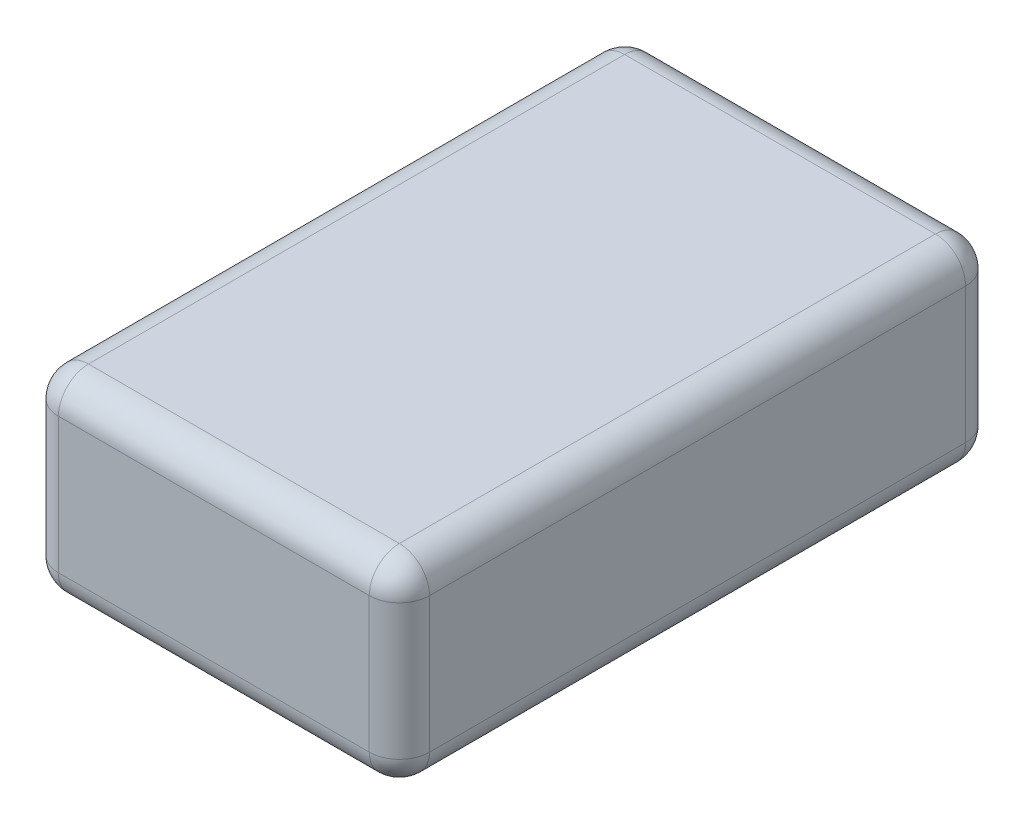
ISO-10303-21;
HEADER;
FILE_DESCRIPTION(('STEP AP214'),'2;1');
FILE_NAME('part.step','',(''),(''),'','','');
FILE_SCHEMA(('AUTOMOTIVE_DESIGN { 1 0 10303 214 1 1 1 1 }'));
ENDSEC;
DATA;
#1=APPLICATION_CONTEXT('core data for automotive mechanical design processes');
#2=APPLICATION_PROTOCOL_DEFINITION('international standard','automotive_design',2000,#1);
#3=PRODUCT_CONTEXT('',#1,'mechanical');
#4=PRODUCT('Part','Part','',(#3));
#5=PRODUCT_RELATED_PRODUCT_CATEGORY('part','',(#4));
#6=PRODUCT_DEFINITION_FORMATION('','',#4);
#7=PRODUCT_DEFINITION_CONTEXT('part definition',#1,'design');
#8=PRODUCT_DEFINITION('design','',#6,#7);
#9=PRODUCT_DEFINITION_SHAPE('','',#8);
#10=(LENGTH_UNIT() NAMED_UNIT(*) SI_UNIT(.MILLI.,.METRE.));
#11=(NAMED_UNIT(*) PLANE_ANGLE_UNIT() SI_UNIT($,.RADIAN.));
#12=(NAMED_UNIT(*) SI_UNIT($,.STERADIAN.) SOLID_ANGLE_UNIT());
#13=UNCERTAINTY_MEASURE_WITH_UNIT(LENGTH_MEASURE(1.E-05),#10,'distance_accuracy_value','');
#14=(GEOMETRIC_REPRESENTATION_CONTEXT(3) GLOBAL_UNCERTAINTY_ASSIGNED_CONTEXT((#13)) GLOBAL_UNIT_ASSIGNED_CONTEXT((#10,
#11,#12)) REPRESENTATION_CONTEXT('',''));
#15=CARTESIAN_POINT('',(0.,0.,0.));
#16=DIRECTION('',(0.,0.,1.));
#17=DIRECTION('',(1.,0.,0.));
#18=AXIS2_PLACEMENT_3D('',#15,#16,#17);
#19=CARTESIAN_POINT('',(113.2,10.,198.));
#20=DIRECTION('',(0.,0.,-1.));
#21=DIRECTION('',(-1.,0.,0.));
#22=AXIS2_PLACEMENT_3D('',#19,#20,#21);
#23=CYLINDRICAL_SURFACE('',#22,10.);
#24=DIRECTION('',(0.,0.,-1.));
#25=VECTOR('',#24,1.);
#26=CARTESIAN_POINT('',(113.2,0.,198.));
#27=LINE('',#26,#25);
#28=CARTESIAN_POINT('',(113.2,0.,10.));
#29=VERTEX_POINT('',#28);
#30=CARTESIAN_POINT('',(113.2,0.,188.));
#31=VERTEX_POINT('',#30);
#32=EDGE_CURVE('E277',#29,#31,#27,.F.);
#33=ORIENTED_EDGE('',*,*,#32,.F.);
#34=CARTESIAN_POINT('',(113.2,10.,10.));
#35=DIRECTION('',(0.,0.,-1.));
#36=DIRECTION('',(-1.,0.,0.));
#37=AXIS2_PLACEMENT_3D('',#34,#35,#36);
#38=CIRCLE('',#37,10.);
#39=CARTESIAN_POINT('',(123.2,10.,10.));
#40=VERTEX_POINT('',#39);
#41=EDGE_CURVE('E232',#29,#40,#38,.F.);
#42=ORIENTED_EDGE('',*,*,#41,.T.);
#43=DIRECTION('',(0.,0.,-1.));
#44=VECTOR('',#43,1.);
#45=CARTESIAN_POINT('',(123.2,10.,198.));
#46=LINE('',#45,#44);
#47=CARTESIAN_POINT('',(123.2,10.,188.));
#48=VERTEX_POINT('',#47);
#49=EDGE_CURVE('E215',#48,#40,#46,.T.);
#50=ORIENTED_EDGE('',*,*,#49,.F.);
#51=CARTESIAN_POINT('',(113.2,10.,188.));
#52=DIRECTION('',(0.,0.,-1.));
#53=DIRECTION('',(-1.,0.,0.));
#54=AXIS2_PLACEMENT_3D('',#51,#52,#53);
#55=CIRCLE('',#54,10.);
#56=EDGE_CURVE('E229',#48,#31,#55,.T.);
#57=ORIENTED_EDGE('',*,*,#56,.T.);
#58=EDGE_LOOP('',(#33,#42,#50,#57));
#59=FACE_BOUND('',#58,.T.);
#60=ADVANCED_FACE('F34',(#59),#23,.T.);
#61=CARTESIAN_POINT('',(0.,10.,188.));
#62=DIRECTION('',(-1.,0.,0.));
#63=DIRECTION('',(0.,0.,1.));
#64=AXIS2_PLACEMENT_3D('',#61,#62,#63);
#65=CYLINDRICAL_SURFACE('',#64,10.);
#66=DIRECTION('',(1.,0.,0.));
#67=VECTOR('',#66,1.);
#68=CARTESIAN_POINT('',(0.,0.,188.));
#69=LINE('',#68,#67);
#70=CARTESIAN_POINT('',(10.,0.,188.));
#71=VERTEX_POINT('',#70);
#72=EDGE_CURVE('E291',#31,#71,#69,.F.);
#73=ORIENTED_EDGE('',*,*,#72,.F.);
#74=CARTESIAN_POINT('',(113.2,10.,188.));
#75=DIRECTION('',(-1.,0.,0.));
#76=DIRECTION('',(0.,0.,1.));
#77=AXIS2_PLACEMENT_3D('',#74,#75,#76);
#78=CIRCLE('',#77,10.);
#79=CARTESIAN_POINT('',(113.2,10.,198.));
#80=VERTEX_POINT('',#79);
#81=EDGE_CURVE('E241',#31,#80,#78,.T.);
#82=ORIENTED_EDGE('',*,*,#81,.T.);
#83=DIRECTION('',(1.,0.,0.));
#84=VECTOR('',#83,1.);
#85=CARTESIAN_POINT('',(0.,10.,198.));
#86=LINE('',#85,#84);
#87=CARTESIAN_POINT('',(10.,10.,198.));
#88=VERTEX_POINT('',#87);
#89=EDGE_CURVE('E211',#88,#80,#86,.T.);
#90=ORIENTED_EDGE('',*,*,#89,.F.);
#91=CARTESIAN_POINT('',(10.,10.,188.));
#92=DIRECTION('',(-1.,0.,0.));
#93=DIRECTION('',(0.,0.,1.));
#94=AXIS2_PLACEMENT_3D('',#91,#92,#93);
#95=CIRCLE('',#94,10.);
#96=EDGE_CURVE('E238',#88,#71,#95,.F.);
#97=ORIENTED_EDGE('',*,*,#96,.T.);
#98=EDGE_LOOP('',(#73,#82,#90,#97));
#99=FACE_BOUND('',#98,.T.);
#100=ADVANCED_FACE('F316',(#99),#65,.T.);
#101=CARTESIAN_POINT('',(10.,10.,198.));
#102=DIRECTION('',(0.,0.,-1.));
#103=DIRECTION('',(-1.,0.,0.));
#104=AXIS2_PLACEMENT_3D('',#101,#102,#103);
#105=CYLINDRICAL_SURFACE('',#104,10.);
#106=DIRECTION('',(0.,0.,1.));
#107=VECTOR('',#106,1.);
#108=CARTESIAN_POINT('',(10.,0.,198.));
#109=LINE('',#108,#107);
#110=CARTESIAN_POINT('',(10.,0.,10.));
#111=VERTEX_POINT('',#110);
#112=EDGE_CURVE('E218',#71,#111,#109,.F.);
#113=ORIENTED_EDGE('',*,*,#112,.F.);
#114=CARTESIAN_POINT('',(10.,10.,188.));
#115=DIRECTION('',(0.,0.,-1.));
#116=DIRECTION('',(-1.,0.,0.));
#117=AXIS2_PLACEMENT_3D('',#114,#115,#116);
#118=CIRCLE('',#117,10.);
#119=CARTESIAN_POINT('',(0.,10.,188.));
#120=VERTEX_POINT('',#119);
#121=EDGE_CURVE('E157',#71,#120,#118,.T.);
#122=ORIENTED_EDGE('',*,*,#121,.T.);
#123=DIRECTION('',(0.,0.,1.));
#124=VECTOR('',#123,1.);
#125=CARTESIAN_POINT('',(0.,10.,198.));
#126=LINE('',#125,#124);
#127=CARTESIAN_POINT('',(0.,10.,10.));
#128=VERTEX_POINT('',#127);
#129=EDGE_CURVE('E204',#128,#120,#126,.T.);
#130=ORIENTED_EDGE('',*,*,#129,.F.);
#131=CARTESIAN_POINT('',(10.,10.,10.));
#132=DIRECTION('',(0.,0.,-1.));
#133=DIRECTION('',(-1.,0.,0.));
#134=AXIS2_PLACEMENT_3D('',#131,#132,#133);
#135=CIRCLE('',#134,10.);
#136=EDGE_CURVE('E161',#128,#111,#135,.F.);
#137=ORIENTED_EDGE('',*,*,#136,.T.);
#138=EDGE_LOOP('',(#113,#122,#130,#137));
#139=FACE_BOUND('',#138,.T.);
#140=ADVANCED_FACE('F209',(#139),#105,.T.);
#141=CARTESIAN_POINT('',(0.,10.,10.));
#142=DIRECTION('',(-1.,0.,0.));
#143=DIRECTION('',(0.,0.,1.));
#144=AXIS2_PLACEMENT_3D('',#141,#142,#143);
#145=CYLINDRICAL_SURFACE('',#144,10.);
#146=DIRECTION('',(-1.,0.,0.));
#147=VECTOR('',#146,1.);
#148=CARTESIAN_POINT('',(0.,10.,0.));
#149=LINE('',#148,#147);
#150=CARTESIAN_POINT('',(113.2,10.,0.));
#151=VERTEX_POINT('',#150);
#152=CARTESIAN_POINT('',(10.,10.,0.));
#153=VERTEX_POINT('',#152);
#154=EDGE_CURVE('E287',#151,#153,#149,.T.);
#155=ORIENTED_EDGE('',*,*,#154,.F.);
#156=CARTESIAN_POINT('',(113.2,10.,10.));
#157=DIRECTION('',(-1.,0.,0.));
#158=DIRECTION('',(0.,0.,1.));
#159=AXIS2_PLACEMENT_3D('',#156,#157,#158);
#160=CIRCLE('',#159,10.);
#161=EDGE_CURVE('E226',#151,#29,#160,.T.);
#162=ORIENTED_EDGE('',*,*,#161,.T.);
#163=DIRECTION('',(-1.,0.,0.));
#164=VECTOR('',#163,1.);
#165=CARTESIAN_POINT('',(0.,0.,10.));
#166=LINE('',#165,#164);
#167=EDGE_CURVE('E212',#111,#29,#166,.F.);
#168=ORIENTED_EDGE('',*,*,#167,.F.);
#169=CARTESIAN_POINT('',(10.,10.,10.));
#170=DIRECTION('',(-1.,0.,0.));
#171=DIRECTION('',(0.,0.,1.));
#172=AXIS2_PLACEMENT_3D('',#169,#170,#171);
#173=CIRCLE('',#172,10.);
#174=EDGE_CURVE('E224',#111,#153,#173,.F.);
#175=ORIENTED_EDGE('',*,*,#174,.T.);
#176=EDGE_LOOP('',(#155,#162,#168,#175));
#177=FACE_BOUND('',#176,.T.);
#178=ADVANCED_FACE('F284',(#177),#145,.T.);
#179=CARTESIAN_POINT('',(10.,55.,198.));
#180=DIRECTION('',(0.,0.,-1.));
#181=DIRECTION('',(-1.,0.,0.));
#182=AXIS2_PLACEMENT_3D('',#179,#180,#181);
#183=CYLINDRICAL_SURFACE('',#182,10.);
#184=DIRECTION('',(0.,0.,-1.));
#185=VECTOR('',#184,1.);
#186=CARTESIAN_POINT('',(0.,55.,198.));
#187=LINE('',#186,#185);
#188=CARTESIAN_POINT('',(0.,55.,188.));
#189=VERTEX_POINT('',#188);
#190=CARTESIAN_POINT('',(0.,55.,10.));
#191=VERTEX_POINT('',#190);
#192=EDGE_CURVE('E205',#189,#191,#187,.T.);
#193=ORIENTED_EDGE('',*,*,#192,.F.);
#194=CARTESIAN_POINT('',(10.,55.,188.));
#195=DIRECTION('',(0.,0.,-1.));
#196=DIRECTION('',(-1.,0.,0.));
#197=AXIS2_PLACEMENT_3D('',#194,#195,#196);
#198=CIRCLE('',#197,10.);
#199=CARTESIAN_POINT('',(10.,65.,188.));
#200=VERTEX_POINT('',#199);
#201=EDGE_CURVE('E152',#189,#200,#198,.T.);
#202=ORIENTED_EDGE('',*,*,#201,.T.);
#203=DIRECTION('',(0.,0.,-1.));
#204=VECTOR('',#203,1.);
#205=CARTESIAN_POINT('',(10.,65.,198.));
#206=LINE('',#205,#204);
#207=CARTESIAN_POINT('',(10.,65.,10.));
#208=VERTEX_POINT('',#207);
#209=EDGE_CURVE('E143',#208,#200,#206,.F.);
#210=ORIENTED_EDGE('',*,*,#209,.F.);
#211=CARTESIAN_POINT('',(10.,55.,10.));
#212=DIRECTION('',(0.,0.,-1.));
#213=DIRECTION('',(-1.,0.,0.));
#214=AXIS2_PLACEMENT_3D('',#211,#212,#213);
#215=CIRCLE('',#214,10.);
#216=EDGE_CURVE('E51',#208,#191,#215,.F.);
#217=ORIENTED_EDGE('',*,*,#216,.T.);
#218=EDGE_LOOP('',(#193,#202,#210,#217));
#219=FACE_BOUND('',#218,.T.);
#220=ADVANCED_FACE('F150',(#219),#183,.T.);
#221=CARTESIAN_POINT('',(0.,55.,188.));
#222=DIRECTION('',(-1.,0.,0.));
#223=DIRECTION('',(0.,0.,1.));
#224=AXIS2_PLACEMENT_3D('',#221,#222,#223);
#225=CYLINDRICAL_SURFACE('',#224,10.);
#226=DIRECTION('',(-1.,0.,0.));
#227=VECTOR('',#226,1.);
#228=CARTESIAN_POINT('',(0.,55.,198.));
#229=LINE('',#228,#227);
#230=CARTESIAN_POINT('',(113.2,55.,198.));
#231=VERTEX_POINT('',#230);
#232=CARTESIAN_POINT('',(10.,55.,198.));
#233=VERTEX_POINT('',#232);
#234=EDGE_CURVE('E251',#231,#233,#229,.T.);
#235=ORIENTED_EDGE('',*,*,#234,.F.);
#236=CARTESIAN_POINT('',(113.2,55.,188.));
#237=DIRECTION('',(-1.,0.,0.));
#238=DIRECTION('',(0.,0.,1.));
#239=AXIS2_PLACEMENT_3D('',#236,#237,#238);
#240=CIRCLE('',#239,10.);
#241=CARTESIAN_POINT('',(113.2,65.,188.));
#242=VERTEX_POINT('',#241);
#243=EDGE_CURVE('E245',#231,#242,#240,.T.);
#244=ORIENTED_EDGE('',*,*,#243,.T.);
#245=DIRECTION('',(-1.,0.,0.));
#246=VECTOR('',#245,1.);
#247=CARTESIAN_POINT('',(0.,65.,188.));
#248=LINE('',#247,#246);
#249=EDGE_CURVE('E154',#200,#242,#248,.F.);
#250=ORIENTED_EDGE('',*,*,#249,.F.);
#251=CARTESIAN_POINT('',(10.,55.,188.));
#252=DIRECTION('',(-1.,0.,0.));
#253=DIRECTION('',(0.,0.,1.));
#254=AXIS2_PLACEMENT_3D('',#251,#252,#253);
#255=CIRCLE('',#254,10.);
#256=EDGE_CURVE('E243',#200,#233,#255,.F.);
#257=ORIENTED_EDGE('',*,*,#256,.T.);
#258=EDGE_LOOP('',(#235,#244,#250,#257));
#259=FACE_BOUND('',#258,.T.);
#260=ADVANCED_FACE('F249',(#259),#225,.T.);
#261=CARTESIAN_POINT('',(113.2,55.,198.));
#262=DIRECTION('',(0.,0.,-1.));
#263=DIRECTION('',(-1.,0.,0.));
#264=AXIS2_PLACEMENT_3D('',#261,#262,#263);
#265=CYLINDRICAL_SURFACE('',#264,10.);
#266=DIRECTION('',(0.,0.,1.));
#267=VECTOR('',#266,1.);
#268=CARTESIAN_POINT('',(123.2,55.,198.));
#269=LINE('',#268,#267);
#270=CARTESIAN_POINT('',(123.2,55.,10.));
#271=VERTEX_POINT('',#270);
#272=CARTESIAN_POINT('',(123.2,55.,188.));
#273=VERTEX_POINT('',#272);
#274=EDGE_CURVE('E148',#271,#273,#269,.T.);
#275=ORIENTED_EDGE('',*,*,#274,.F.);
#276=CARTESIAN_POINT('',(113.2,55.,10.));
#277=DIRECTION('',(0.,0.,-1.));
#278=DIRECTION('',(-1.,0.,0.));
#279=AXIS2_PLACEMENT_3D('',#276,#277,#278);
#280=CIRCLE('',#279,10.);
#281=CARTESIAN_POINT('',(113.2,65.,10.));
#282=VERTEX_POINT('',#281);
#283=EDGE_CURVE('E137',#271,#282,#280,.F.);
#284=ORIENTED_EDGE('',*,*,#283,.T.);
#285=DIRECTION('',(0.,0.,1.));
#286=VECTOR('',#285,1.);
#287=CARTESIAN_POINT('',(113.2,65.,198.));
#288=LINE('',#287,#286);
#289=EDGE_CURVE('E146',#242,#282,#288,.F.);
#290=ORIENTED_EDGE('',*,*,#289,.F.);
#291=CARTESIAN_POINT('',(113.2,55.,188.));
#292=DIRECTION('',(0.,0.,-1.));
#293=DIRECTION('',(-1.,0.,0.));
#294=AXIS2_PLACEMENT_3D('',#291,#292,#293);
#295=CIRCLE('',#294,10.);
#296=EDGE_CURVE('E234',#242,#273,#295,.T.);
#297=ORIENTED_EDGE('',*,*,#296,.T.);
#298=EDGE_LOOP('',(#275,#284,#290,#297));
#299=FACE_BOUND('',#298,.T.);
#300=ADVANCED_FACE('F257',(#299),#265,.T.);
#301=CARTESIAN_POINT('',(0.,55.,10.));
#302=DIRECTION('',(-1.,0.,0.));
#303=DIRECTION('',(0.,0.,1.));
#304=AXIS2_PLACEMENT_3D('',#301,#302,#303);
#305=CYLINDRICAL_SURFACE('',#304,10.);
#306=DIRECTION('',(1.,0.,0.));
#307=VECTOR('',#306,1.);
#308=CARTESIAN_POINT('',(0.,65.,10.));
#309=LINE('',#308,#307);
#310=EDGE_CURVE('E129',#282,#208,#309,.F.);
#311=ORIENTED_EDGE('',*,*,#310,.F.);
#312=CARTESIAN_POINT('',(113.2,55.,10.));
#313=DIRECTION('',(-1.,0.,0.));
#314=DIRECTION('',(0.,0.,1.));
#315=AXIS2_PLACEMENT_3D('',#312,#313,#314);
#316=CIRCLE('',#315,10.);
#317=CARTESIAN_POINT('',(113.2,55.,0.));
#318=VERTEX_POINT('',#317);
#319=EDGE_CURVE('E136',#282,#318,#316,.T.);
#320=ORIENTED_EDGE('',*,*,#319,.T.);
#321=DIRECTION('',(1.,0.,0.));
#322=VECTOR('',#321,1.);
#323=CARTESIAN_POINT('',(0.,55.,0.));
#324=LINE('',#323,#322);
#325=CARTESIAN_POINT('',(10.,55.,0.));
#326=VERTEX_POINT('',#325);
#327=EDGE_CURVE('E132',#326,#318,#324,.T.);
#328=ORIENTED_EDGE('',*,*,#327,.F.);
#329=CARTESIAN_POINT('',(10.,55.,10.));
#330=DIRECTION('',(-1.,0.,0.));
#331=DIRECTION('',(0.,0.,1.));
#332=AXIS2_PLACEMENT_3D('',#329,#330,#331);
#333=CIRCLE('',#332,10.);
#334=EDGE_CURVE('E126',#326,#208,#333,.F.);
#335=ORIENTED_EDGE('',*,*,#334,.T.);
#336=EDGE_LOOP('',(#311,#320,#328,#335));
#337=FACE_BOUND('',#336,.T.);
#338=ADVANCED_FACE('F128',(#337),#305,.T.);
#339=CARTESIAN_POINT('',(0.,0.,198.));
#340=DIRECTION('',(0.,1.,0.));
#341=DIRECTION('',(0.,0.,1.));
#342=AXIS2_PLACEMENT_3D('',#339,#340,#341);
#343=PLANE('',#342);
#344=ORIENTED_EDGE('',*,*,#112,.T.);
#345=ORIENTED_EDGE('',*,*,#167,.T.);
#346=ORIENTED_EDGE('',*,*,#32,.T.);
#347=ORIENTED_EDGE('',*,*,#72,.T.);
#348=EDGE_LOOP('',(#344,#345,#346,#347));
#349=FACE_BOUND('',#348,.T.);
#350=ADVANCED_FACE('F289',(#349),#343,.F.);
#351=CARTESIAN_POINT('',(123.2,0.,198.));
#352=DIRECTION('',(-1.,0.,0.));
#353=DIRECTION('',(0.,0.,1.));
#354=AXIS2_PLACEMENT_3D('',#351,#352,#353);
#355=PLANE('',#354);
#356=ORIENTED_EDGE('',*,*,#49,.T.);
#357=DIRECTION('',(0.,1.,0.));
#358=VECTOR('',#357,1.);
#359=CARTESIAN_POINT('',(123.2,0.,10.));
#360=LINE('',#359,#358);
#361=EDGE_CURVE('E166',#40,#271,#360,.T.);
#362=ORIENTED_EDGE('',*,*,#361,.T.);
#363=ORIENTED_EDGE('',*,*,#274,.T.);
#364=DIRECTION('',(0.,1.,0.));
#365=VECTOR('',#364,1.);
#366=CARTESIAN_POINT('',(123.2,10.,188.));
#367=LINE('',#366,#365);
#368=EDGE_CURVE('E159',#273,#48,#367,.F.);
#369=ORIENTED_EDGE('',*,*,#368,.T.);
#370=EDGE_LOOP('',(#356,#362,#363,#369));
#371=FACE_BOUND('',#370,.T.);
#372=ADVANCED_FACE('F271',(#371),#355,.F.);
#373=CARTESIAN_POINT('',(0.,65.,198.));
#374=DIRECTION('',(0.,1.,0.));
#375=DIRECTION('',(0.,0.,1.));
#376=AXIS2_PLACEMENT_3D('',#373,#374,#375);
#377=PLANE('',#376);
#378=ORIENTED_EDGE('',*,*,#289,.T.);
#379=ORIENTED_EDGE('',*,*,#310,.T.);
#380=ORIENTED_EDGE('',*,*,#209,.T.);
#381=ORIENTED_EDGE('',*,*,#249,.T.);
#382=EDGE_LOOP('',(#378,#379,#380,#381));
#383=FACE_BOUND('',#382,.T.);
#384=ADVANCED_FACE('F141',(#383),#377,.T.);
#385=CARTESIAN_POINT('',(0.,0.,198.));
#386=DIRECTION('',(-1.,0.,0.));
#387=DIRECTION('',(0.,0.,1.));
#388=AXIS2_PLACEMENT_3D('',#385,#386,#387);
#389=PLANE('',#388);
#390=ORIENTED_EDGE('',*,*,#129,.T.);
#391=DIRECTION('',(0.,1.,0.));
#392=VECTOR('',#391,1.);
#393=CARTESIAN_POINT('',(0.,0.,188.));
#394=LINE('',#393,#392);
#395=EDGE_CURVE('E11',#120,#189,#394,.T.);
#396=ORIENTED_EDGE('',*,*,#395,.T.);
#397=ORIENTED_EDGE('',*,*,#192,.T.);
#398=DIRECTION('',(0.,1.,0.));
#399=VECTOR('',#398,1.);
#400=CARTESIAN_POINT('',(0.,10.,10.));
#401=LINE('',#400,#399);
#402=EDGE_CURVE('E43',#191,#128,#401,.F.);
#403=ORIENTED_EDGE('',*,*,#402,.T.);
#404=EDGE_LOOP('',(#390,#396,#397,#403));
#405=FACE_BOUND('',#404,.T.);
#406=ADVANCED_FACE('F203',(#405),#389,.T.);
#407=CARTESIAN_POINT('',(0.,0.,198.));
#408=DIRECTION('',(0.,0.,1.));
#409=DIRECTION('',(1.,0.,0.));
#410=AXIS2_PLACEMENT_3D('',#407,#408,#409);
#411=PLANE('',#410);
#412=ORIENTED_EDGE('',*,*,#89,.T.);
#413=DIRECTION('',(0.,1.,0.));
#414=VECTOR('',#413,1.);
#415=CARTESIAN_POINT('',(113.2,55.,198.));
#416=LINE('',#415,#414);
#417=EDGE_CURVE('E174',#80,#231,#416,.T.);
#418=ORIENTED_EDGE('',*,*,#417,.T.);
#419=ORIENTED_EDGE('',*,*,#234,.T.);
#420=DIRECTION('',(0.,1.,0.));
#421=VECTOR('',#420,1.);
#422=CARTESIAN_POINT('',(10.,0.,198.));
#423=LINE('',#422,#421);
#424=EDGE_CURVE('E172',#233,#88,#423,.F.);
#425=ORIENTED_EDGE('',*,*,#424,.T.);
#426=EDGE_LOOP('',(#412,#418,#419,#425));
#427=FACE_BOUND('',#426,.T.);
#428=ADVANCED_FACE('F344',(#427),#411,.T.);
#429=CARTESIAN_POINT('',(0.,0.,0.));
#430=DIRECTION('',(0.,0.,1.));
#431=DIRECTION('',(1.,0.,0.));
#432=AXIS2_PLACEMENT_3D('',#429,#430,#431);
#433=PLANE('',#432);
#434=ORIENTED_EDGE('',*,*,#327,.T.);
#435=DIRECTION('',(0.,1.,0.));
#436=VECTOR('',#435,1.);
#437=CARTESIAN_POINT('',(113.2,0.,0.));
#438=LINE('',#437,#436);
#439=EDGE_CURVE('E170',#318,#151,#438,.F.);
#440=ORIENTED_EDGE('',*,*,#439,.T.);
#441=ORIENTED_EDGE('',*,*,#154,.T.);
#442=DIRECTION('',(0.,1.,0.));
#443=VECTOR('',#442,1.);
#444=CARTESIAN_POINT('',(10.,55.,0.));
#445=LINE('',#444,#443);
#446=EDGE_CURVE('E168',#153,#326,#445,.T.);
#447=ORIENTED_EDGE('',*,*,#446,.T.);
#448=EDGE_LOOP('',(#434,#440,#441,#447));
#449=FACE_BOUND('',#448,.T.);
#450=ADVANCED_FACE('F301',(#449),#433,.F.);
#451=CARTESIAN_POINT('',(113.2,55.,10.));
#452=DIRECTION('',(0.,0.,1.));
#453=DIRECTION('',(1.,0.,0.));
#454=AXIS2_PLACEMENT_3D('',#451,#452,#453);
#455=SPHERICAL_SURFACE('',#454,10.);
#456=ORIENTED_EDGE('',*,*,#319,.F.);
#457=ORIENTED_EDGE('',*,*,#283,.F.);
#458=CARTESIAN_POINT('',(113.2,55.,10.));
#459=DIRECTION('',(0.,-1.,0.));
#460=DIRECTION('',(0.,0.,-1.));
#461=AXIS2_PLACEMENT_3D('',#458,#459,#460);
#462=CIRCLE('',#461,10.);
#463=EDGE_CURVE('E180',#318,#271,#462,.T.);
#464=ORIENTED_EDGE('',*,*,#463,.F.);
#465=EDGE_LOOP('',(#456,#457,#464));
#466=FACE_BOUND('',#465,.T.);
#467=ADVANCED_FACE('F304',(#466),#455,.T.);
#468=CARTESIAN_POINT('',(113.2,0.,10.));
#469=DIRECTION('',(0.,1.,0.));
#470=DIRECTION('',(0.,0.,1.));
#471=AXIS2_PLACEMENT_3D('',#468,#469,#470);
#472=CYLINDRICAL_SURFACE('',#471,10.);
#473=ORIENTED_EDGE('',*,*,#463,.T.);
#474=ORIENTED_EDGE('',*,*,#361,.F.);
#475=CARTESIAN_POINT('',(113.2,10.,10.));
#476=DIRECTION('',(0.,-1.,0.));
#477=DIRECTION('',(0.,0.,-1.));
#478=AXIS2_PLACEMENT_3D('',#475,#476,#477);
#479=CIRCLE('',#478,10.);
#480=EDGE_CURVE('E177',#151,#40,#479,.T.);
#481=ORIENTED_EDGE('',*,*,#480,.F.);
#482=ORIENTED_EDGE('',*,*,#439,.F.);
#483=EDGE_LOOP('',(#473,#474,#481,#482));
#484=FACE_BOUND('',#483,.T.);
#485=ADVANCED_FACE('F306',(#484),#472,.T.);
#486=CARTESIAN_POINT('',(113.2,10.,10.));
#487=DIRECTION('',(0.,0.,1.));
#488=DIRECTION('',(1.,0.,0.));
#489=AXIS2_PLACEMENT_3D('',#486,#487,#488);
#490=SPHERICAL_SURFACE('',#489,10.);
#491=ORIENTED_EDGE('',*,*,#480,.T.);
#492=ORIENTED_EDGE('',*,*,#41,.F.);
#493=ORIENTED_EDGE('',*,*,#161,.F.);
#494=EDGE_LOOP('',(#491,#492,#493));
#495=FACE_BOUND('',#494,.T.);
#496=ADVANCED_FACE('F280',(#495),#490,.T.);
#497=CARTESIAN_POINT('',(113.2,55.,188.));
#498=DIRECTION('',(0.,0.,1.));
#499=DIRECTION('',(1.,0.,0.));
#500=AXIS2_PLACEMENT_3D('',#497,#498,#499);
#501=SPHERICAL_SURFACE('',#500,10.);
#502=ORIENTED_EDGE('',*,*,#296,.F.);
#503=ORIENTED_EDGE('',*,*,#243,.F.);
#504=CARTESIAN_POINT('',(113.2,55.,188.));
#505=DIRECTION('',(0.,-1.,0.));
#506=DIRECTION('',(0.,0.,-1.));
#507=AXIS2_PLACEMENT_3D('',#504,#505,#506);
#508=CIRCLE('',#507,10.);
#509=EDGE_CURVE('E181',#273,#231,#508,.T.);
#510=ORIENTED_EDGE('',*,*,#509,.F.);
#511=EDGE_LOOP('',(#502,#503,#510));
#512=FACE_BOUND('',#511,.T.);
#513=ADVANCED_FACE('F262',(#512),#501,.T.);
#514=CARTESIAN_POINT('',(113.2,0.,188.));
#515=DIRECTION('',(0.,-1.,0.));
#516=DIRECTION('',(0.,0.,-1.));
#517=AXIS2_PLACEMENT_3D('',#514,#515,#516);
#518=CYLINDRICAL_SURFACE('',#517,10.);
#519=ORIENTED_EDGE('',*,*,#509,.T.);
#520=ORIENTED_EDGE('',*,*,#417,.F.);
#521=CARTESIAN_POINT('',(113.2,10.,188.));
#522=DIRECTION('',(0.,-1.,0.));
#523=DIRECTION('',(0.,0.,-1.));
#524=AXIS2_PLACEMENT_3D('',#521,#522,#523);
#525=CIRCLE('',#524,10.);
#526=EDGE_CURVE('E184',#48,#80,#525,.T.);
#527=ORIENTED_EDGE('',*,*,#526,.F.);
#528=ORIENTED_EDGE('',*,*,#368,.F.);
#529=EDGE_LOOP('',(#519,#520,#527,#528));
#530=FACE_BOUND('',#529,.T.);
#531=ADVANCED_FACE('F267',(#530),#518,.T.);
#532=CARTESIAN_POINT('',(113.2,10.,188.));
#533=DIRECTION('',(0.,0.,1.));
#534=DIRECTION('',(1.,0.,0.));
#535=AXIS2_PLACEMENT_3D('',#532,#533,#534);
#536=SPHERICAL_SURFACE('',#535,10.);
#537=ORIENTED_EDGE('',*,*,#526,.T.);
#538=ORIENTED_EDGE('',*,*,#81,.F.);
#539=ORIENTED_EDGE('',*,*,#56,.F.);
#540=EDGE_LOOP('',(#537,#538,#539));
#541=FACE_BOUND('',#540,.T.);
#542=ADVANCED_FACE('F355',(#541),#536,.T.);
#543=CARTESIAN_POINT('',(10.,55.,188.));
#544=DIRECTION('',(0.,0.,1.));
#545=DIRECTION('',(1.,0.,0.));
#546=AXIS2_PLACEMENT_3D('',#543,#544,#545);
#547=SPHERICAL_SURFACE('',#546,10.);
#548=ORIENTED_EDGE('',*,*,#256,.F.);
#549=ORIENTED_EDGE('',*,*,#201,.F.);
#550=CARTESIAN_POINT('',(10.,55.,188.));
#551=DIRECTION('',(0.,-1.,0.));
#552=DIRECTION('',(0.,0.,-1.));
#553=AXIS2_PLACEMENT_3D('',#550,#551,#552);
#554=CIRCLE('',#553,10.);
#555=EDGE_CURVE('E187',#233,#189,#554,.T.);
#556=ORIENTED_EDGE('',*,*,#555,.F.);
#557=EDGE_LOOP('',(#548,#549,#556));
#558=FACE_BOUND('',#557,.T.);
#559=ADVANCED_FACE('F363',(#558),#547,.T.);
#560=CARTESIAN_POINT('',(10.,0.,188.));
#561=DIRECTION('',(0.,1.,0.));
#562=DIRECTION('',(0.,0.,1.));
#563=AXIS2_PLACEMENT_3D('',#560,#561,#562);
#564=CYLINDRICAL_SURFACE('',#563,10.);
#565=ORIENTED_EDGE('',*,*,#555,.T.);
#566=ORIENTED_EDGE('',*,*,#395,.F.);
#567=CARTESIAN_POINT('',(10.,10.,188.));
#568=DIRECTION('',(0.,-1.,0.));
#569=DIRECTION('',(0.,0.,-1.));
#570=AXIS2_PLACEMENT_3D('',#567,#568,#569);
#571=CIRCLE('',#570,10.);
#572=EDGE_CURVE('E190',#88,#120,#571,.T.);
#573=ORIENTED_EDGE('',*,*,#572,.F.);
#574=ORIENTED_EDGE('',*,*,#424,.F.);
#575=EDGE_LOOP('',(#565,#566,#573,#574));
#576=FACE_BOUND('',#575,.T.);
#577=ADVANCED_FACE('F360',(#576),#564,.T.);
#578=CARTESIAN_POINT('',(10.,10.,188.));
#579=DIRECTION('',(0.,0.,1.));
#580=DIRECTION('',(1.,0.,0.));
#581=AXIS2_PLACEMENT_3D('',#578,#579,#580);
#582=SPHERICAL_SURFACE('',#581,10.);
#583=ORIENTED_EDGE('',*,*,#572,.T.);
#584=ORIENTED_EDGE('',*,*,#121,.F.);
#585=ORIENTED_EDGE('',*,*,#96,.F.);
#586=EDGE_LOOP('',(#583,#584,#585));
#587=FACE_BOUND('',#586,.T.);
#588=ADVANCED_FACE('F358',(#587),#582,.T.);
#589=CARTESIAN_POINT('',(10.,55.,10.));
#590=DIRECTION('',(0.,0.,1.));
#591=DIRECTION('',(1.,0.,0.));
#592=AXIS2_PLACEMENT_3D('',#589,#590,#591);
#593=SPHERICAL_SURFACE('',#592,10.);
#594=ORIENTED_EDGE('',*,*,#216,.F.);
#595=ORIENTED_EDGE('',*,*,#334,.F.);
#596=CARTESIAN_POINT('',(10.,55.,10.));
#597=DIRECTION('',(0.,-1.,0.));
#598=DIRECTION('',(0.,0.,-1.));
#599=AXIS2_PLACEMENT_3D('',#596,#597,#598);
#600=CIRCLE('',#599,10.);
#601=EDGE_CURVE('E38',#191,#326,#600,.T.);
#602=ORIENTED_EDGE('',*,*,#601,.F.);
#603=EDGE_LOOP('',(#594,#595,#602));
#604=FACE_BOUND('',#603,.T.);
#605=ADVANCED_FACE('F36',(#604),#593,.T.);
#606=CARTESIAN_POINT('',(10.,0.,10.));
#607=DIRECTION('',(0.,-1.,0.));
#608=DIRECTION('',(0.,0.,-1.));
#609=AXIS2_PLACEMENT_3D('',#606,#607,#608);
#610=CYLINDRICAL_SURFACE('',#609,10.);
#611=ORIENTED_EDGE('',*,*,#601,.T.);
#612=ORIENTED_EDGE('',*,*,#446,.F.);
#613=CARTESIAN_POINT('',(10.,10.,10.));
#614=DIRECTION('',(0.,-1.,0.));
#615=DIRECTION('',(0.,0.,-1.));
#616=AXIS2_PLACEMENT_3D('',#613,#614,#615);
#617=CIRCLE('',#616,10.);
#618=EDGE_CURVE('E194',#128,#153,#617,.T.);
#619=ORIENTED_EDGE('',*,*,#618,.F.);
#620=ORIENTED_EDGE('',*,*,#402,.F.);
#621=EDGE_LOOP('',(#611,#612,#619,#620));
#622=FACE_BOUND('',#621,.T.);
#623=ADVANCED_FACE('F201',(#622),#610,.T.);
#624=CARTESIAN_POINT('',(10.,10.,10.));
#625=DIRECTION('',(0.,0.,1.));
#626=DIRECTION('',(1.,0.,0.));
#627=AXIS2_PLACEMENT_3D('',#624,#625,#626);
#628=SPHERICAL_SURFACE('',#627,10.);
#629=ORIENTED_EDGE('',*,*,#618,.T.);
#630=ORIENTED_EDGE('',*,*,#174,.F.);
#631=ORIENTED_EDGE('',*,*,#136,.F.);
#632=EDGE_LOOP('',(#629,#630,#631));
#633=FACE_BOUND('',#632,.T.);
#634=ADVANCED_FACE('F374',(#633),#628,.T.);
#635=CLOSED_SHELL('',(#60,#100,#140,#178,#220,#260,#300,#338,#350,#372,#384,#406,#428,#450,#467,
#485,#496,#513,#531,#542,#559,#577,#588,#605,#623,#634));
#636=MANIFOLD_SOLID_BREP('B2',#635);
#637=ADVANCED_BREP_SHAPE_REPRESENTATION('',(#18,#636),#14);
#638=SHAPE_DEFINITION_REPRESENTATION(#9,#637);
ENDSEC;
END-ISO-10303-21;
